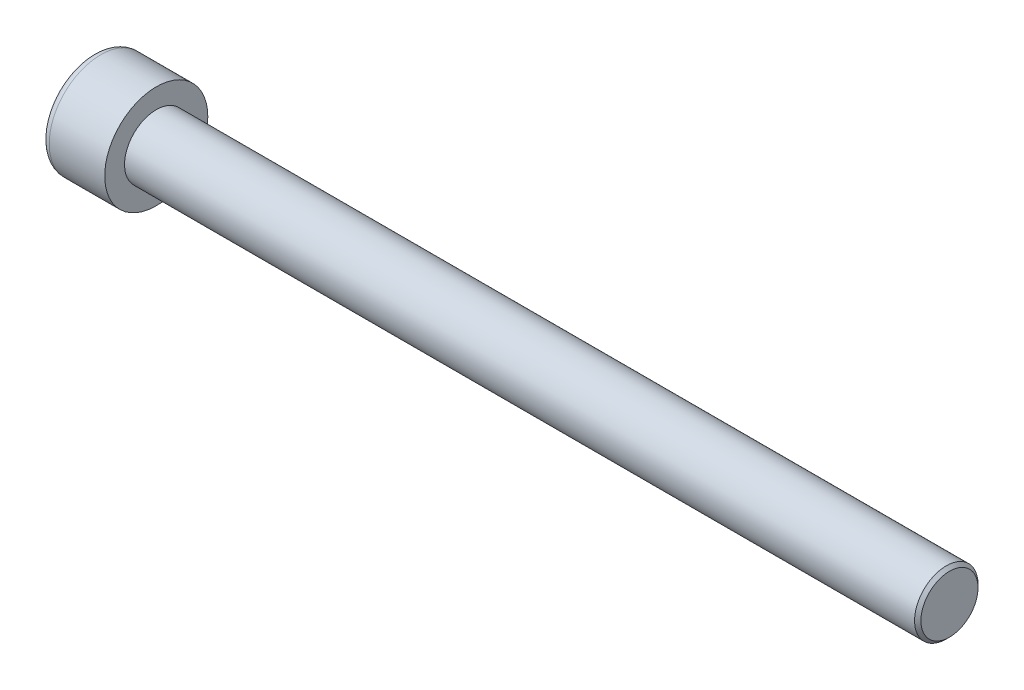
ISO-10303-21;
HEADER;
FILE_DESCRIPTION(('STEP AP214'),'2;1');
FILE_NAME('part.step','',(''),(''),'','','');
FILE_SCHEMA(('AUTOMOTIVE_DESIGN { 1 0 10303 214 1 1 1 1 }'));
ENDSEC;
DATA;
#1=APPLICATION_CONTEXT('core data for automotive mechanical design processes');
#2=APPLICATION_PROTOCOL_DEFINITION('international standard','automotive_design',2000,#1);
#3=PRODUCT_CONTEXT('',#1,'mechanical');
#4=PRODUCT('Part','Part','',(#3));
#5=PRODUCT_RELATED_PRODUCT_CATEGORY('part','',(#4));
#6=PRODUCT_DEFINITION_FORMATION('','',#4);
#7=PRODUCT_DEFINITION_CONTEXT('part definition',#1,'design');
#8=PRODUCT_DEFINITION('design','',#6,#7);
#9=PRODUCT_DEFINITION_SHAPE('','',#8);
#10=(LENGTH_UNIT() NAMED_UNIT(*) SI_UNIT(.MILLI.,.METRE.));
#11=(NAMED_UNIT(*) PLANE_ANGLE_UNIT() SI_UNIT($,.RADIAN.));
#12=(NAMED_UNIT(*) SI_UNIT($,.STERADIAN.) SOLID_ANGLE_UNIT());
#13=UNCERTAINTY_MEASURE_WITH_UNIT(LENGTH_MEASURE(1.E-05),#10,'distance_accuracy_value','');
#14=(GEOMETRIC_REPRESENTATION_CONTEXT(3) GLOBAL_UNCERTAINTY_ASSIGNED_CONTEXT((#13)) GLOBAL_UNIT_ASSIGNED_CONTEXT((#10,
#11,#12)) REPRESENTATION_CONTEXT('',''));
#15=CARTESIAN_POINT('',(0.,0.,0.));
#16=DIRECTION('',(0.,0.,1.));
#17=DIRECTION('',(1.,0.,0.));
#18=AXIS2_PLACEMENT_3D('',#15,#16,#17);
#19=CARTESIAN_POINT('',(4.,0.,-3.46410161513775));
#20=DIRECTION('',(1.,0.,0.));
#21=DIRECTION('',(0.,0.,-1.));
#22=AXIS2_PLACEMENT_3D('',#19,#20,#21);
#23=PLANE('',#22);
#24=CARTESIAN_POINT('',(4.,0.,0.));
#25=DIRECTION('',(1.,0.,0.));
#26=DIRECTION('',(0.,0.,-1.));
#27=AXIS2_PLACEMENT_3D('',#24,#25,#26);
#28=CIRCLE('',#27,3.);
#29=CARTESIAN_POINT('',(4.,-1.5,-2.59807621135332));
#30=VERTEX_POINT('',#29);
#31=CARTESIAN_POINT('',(4.,-3.,0.));
#32=VERTEX_POINT('',#31);
#33=EDGE_CURVE('E156',#30,#32,#28,.F.);
#34=ORIENTED_EDGE('',*,*,#33,.F.);
#35=DIRECTION('',(0.,0.866025403784439,-0.5));
#36=VECTOR('',#35,1.);
#37=CARTESIAN_POINT('',(4.,-3.,-1.73205080756887));
#38=LINE('',#37,#36);
#39=CARTESIAN_POINT('',(4.,-3.,-1.73205080756887));
#40=VERTEX_POINT('',#39);
#41=EDGE_CURVE('E164',#40,#30,#38,.T.);
#42=ORIENTED_EDGE('',*,*,#41,.F.);
#43=DIRECTION('',(0.,0.,-1.));
#44=VECTOR('',#43,1.);
#45=CARTESIAN_POINT('',(4.,-3.,1.73205080756888));
#46=LINE('',#45,#44);
#47=EDGE_CURVE('E181',#32,#40,#46,.T.);
#48=ORIENTED_EDGE('',*,*,#47,.F.);
#49=EDGE_LOOP('',(#34,#42,#48));
#50=FACE_BOUND('',#49,.T.);
#51=ADVANCED_FACE('F33',(#50),#23,.F.);
#52=CARTESIAN_POINT('',(4.,-1.5,2.59807621135331));
#53=VERTEX_POINT('',#52);
#54=EDGE_CURVE('E285',#32,#53,#28,.F.);
#55=ORIENTED_EDGE('',*,*,#54,.F.);
#56=CARTESIAN_POINT('',(4.,-3.,1.73205080756888));
#57=VERTEX_POINT('',#56);
#58=EDGE_CURVE('E182',#57,#32,#46,.T.);
#59=ORIENTED_EDGE('',*,*,#58,.F.);
#60=DIRECTION('',(0.,-0.866025403784438,-0.5));
#61=VECTOR('',#60,1.);
#62=CARTESIAN_POINT('',(4.,0.,3.46410161513776));
#63=LINE('',#62,#61);
#64=EDGE_CURVE('E177',#53,#57,#63,.T.);
#65=ORIENTED_EDGE('',*,*,#64,.F.);
#66=EDGE_LOOP('',(#55,#59,#65));
#67=FACE_BOUND('',#66,.T.);
#68=ADVANCED_FACE('F122',(#67),#23,.F.);
#69=CARTESIAN_POINT('',(4.,1.5,2.59807621135332));
#70=VERTEX_POINT('',#69);
#71=EDGE_CURVE('E281',#53,#70,#28,.F.);
#72=ORIENTED_EDGE('',*,*,#71,.F.);
#73=CARTESIAN_POINT('',(4.,0.,3.46410161513776));
#74=VERTEX_POINT('',#73);
#75=EDGE_CURVE('E178',#74,#53,#63,.T.);
#76=ORIENTED_EDGE('',*,*,#75,.F.);
#77=DIRECTION('',(0.,-0.866025403784439,0.5));
#78=VECTOR('',#77,1.);
#79=CARTESIAN_POINT('',(4.,3.,1.73205080756888));
#80=LINE('',#79,#78);
#81=EDGE_CURVE('E173',#70,#74,#80,.T.);
#82=ORIENTED_EDGE('',*,*,#81,.F.);
#83=EDGE_LOOP('',(#72,#76,#82));
#84=FACE_BOUND('',#83,.T.);
#85=ADVANCED_FACE('F128',(#84),#23,.F.);
#86=CARTESIAN_POINT('',(4.,3.,0.));
#87=VERTEX_POINT('',#86);
#88=EDGE_CURVE('E153',#70,#87,#28,.F.);
#89=ORIENTED_EDGE('',*,*,#88,.F.);
#90=CARTESIAN_POINT('',(4.,3.,1.73205080756888));
#91=VERTEX_POINT('',#90);
#92=EDGE_CURVE('E174',#91,#70,#80,.T.);
#93=ORIENTED_EDGE('',*,*,#92,.F.);
#94=DIRECTION('',(0.,0.,1.));
#95=VECTOR('',#94,1.);
#96=CARTESIAN_POINT('',(4.,3.,-1.73205080756887));
#97=LINE('',#96,#95);
#98=EDGE_CURVE('E168',#87,#91,#97,.T.);
#99=ORIENTED_EDGE('',*,*,#98,.F.);
#100=EDGE_LOOP('',(#89,#93,#99));
#101=FACE_BOUND('',#100,.T.);
#102=ADVANCED_FACE('F142',(#101),#23,.F.);
#103=CARTESIAN_POINT('',(4.,0.,0.));
#104=DIRECTION('',(1.,0.,0.));
#105=DIRECTION('',(0.,0.,-1.));
#106=AXIS2_PLACEMENT_3D('',#103,#104,#105);
#107=CIRCLE('',#106,3.);
#108=CARTESIAN_POINT('',(4.,1.5,-2.59807621135331));
#109=VERTEX_POINT('',#108);
#110=EDGE_CURVE('E48',#109,#87,#107,.T.);
#111=ORIENTED_EDGE('',*,*,#110,.T.);
#112=CARTESIAN_POINT('',(4.,3.,-1.73205080756887));
#113=VERTEX_POINT('',#112);
#114=EDGE_CURVE('E161',#113,#87,#97,.T.);
#115=ORIENTED_EDGE('',*,*,#114,.F.);
#116=DIRECTION('',(0.,0.866025403784438,0.5));
#117=VECTOR('',#116,1.);
#118=CARTESIAN_POINT('',(4.,0.,-3.46410161513775));
#119=LINE('',#118,#117);
#120=EDGE_CURVE('E158',#109,#113,#119,.T.);
#121=ORIENTED_EDGE('',*,*,#120,.F.);
#122=EDGE_LOOP('',(#111,#115,#121));
#123=FACE_BOUND('',#122,.T.);
#124=ADVANCED_FACE('F133',(#123),#23,.F.);
#125=EDGE_CURVE('E146',#109,#30,#28,.F.);
#126=ORIENTED_EDGE('',*,*,#125,.F.);
#127=CARTESIAN_POINT('',(4.,0.,-3.46410161513775));
#128=VERTEX_POINT('',#127);
#129=EDGE_CURVE('E149',#128,#109,#119,.T.);
#130=ORIENTED_EDGE('',*,*,#129,.F.);
#131=EDGE_CURVE('E151',#30,#128,#38,.T.);
#132=ORIENTED_EDGE('',*,*,#131,.F.);
#133=EDGE_LOOP('',(#126,#130,#132));
#134=FACE_BOUND('',#133,.T.);
#135=ADVANCED_FACE('F124',(#134),#23,.F.);
#136=CARTESIAN_POINT('',(0.,0.,0.));
#137=DIRECTION('',(1.,0.,0.));
#138=DIRECTION('',(0.,0.,-1.));
#139=AXIS2_PLACEMENT_3D('',#136,#137,#138);
#140=PLANE('',#139);
#141=CARTESIAN_POINT('',(0.,0.,0.));
#142=DIRECTION('',(1.,0.,0.));
#143=DIRECTION('',(0.,0.,-1.));
#144=AXIS2_PLACEMENT_3D('',#141,#142,#143);
#145=CIRCLE('',#144,5.5);
#146=CARTESIAN_POINT('',(0.,0.,-5.5));
#147=VERTEX_POINT('',#146);
#148=EDGE_CURVE('E220',#147,#147,#145,.F.);
#149=ORIENTED_EDGE('',*,*,#148,.T.);
#150=EDGE_LOOP('',(#149));
#151=FACE_BOUND('',#150,.T.);
#152=DIRECTION('',(0.,0.866025403784439,-0.5));
#153=VECTOR('',#152,1.);
#154=CARTESIAN_POINT('',(0.,-3.,-1.73205080756887));
#155=LINE('',#154,#153);
#156=CARTESIAN_POINT('',(0.,-3.,-1.73205080756887));
#157=VERTEX_POINT('',#156);
#158=CARTESIAN_POINT('',(0.,0.,-3.46410161513775));
#159=VERTEX_POINT('',#158);
#160=EDGE_CURVE('E56',#157,#159,#155,.T.);
#161=ORIENTED_EDGE('',*,*,#160,.T.);
#162=DIRECTION('',(0.,0.866025403784438,0.5));
#163=VECTOR('',#162,1.);
#164=CARTESIAN_POINT('',(0.,0.,-3.46410161513775));
#165=LINE('',#164,#163);
#166=CARTESIAN_POINT('',(0.,3.,-1.73205080756887));
#167=VERTEX_POINT('',#166);
#168=EDGE_CURVE('E187',#159,#167,#165,.T.);
#169=ORIENTED_EDGE('',*,*,#168,.T.);
#170=DIRECTION('',(0.,0.,1.));
#171=VECTOR('',#170,1.);
#172=CARTESIAN_POINT('',(0.,3.,-1.73205080756887));
#173=LINE('',#172,#171);
#174=CARTESIAN_POINT('',(0.,3.,1.73205080756888));
#175=VERTEX_POINT('',#174);
#176=EDGE_CURVE('E190',#167,#175,#173,.T.);
#177=ORIENTED_EDGE('',*,*,#176,.T.);
#178=DIRECTION('',(0.,-0.866025403784439,0.5));
#179=VECTOR('',#178,1.);
#180=CARTESIAN_POINT('',(0.,3.,1.73205080756888));
#181=LINE('',#180,#179);
#182=CARTESIAN_POINT('',(0.,0.,3.46410161513776));
#183=VERTEX_POINT('',#182);
#184=EDGE_CURVE('E193',#175,#183,#181,.T.);
#185=ORIENTED_EDGE('',*,*,#184,.T.);
#186=DIRECTION('',(0.,-0.866025403784438,-0.5));
#187=VECTOR('',#186,1.);
#188=CARTESIAN_POINT('',(0.,0.,3.46410161513776));
#189=LINE('',#188,#187);
#190=CARTESIAN_POINT('',(0.,-3.,1.73205080756888));
#191=VERTEX_POINT('',#190);
#192=EDGE_CURVE('E196',#183,#191,#189,.T.);
#193=ORIENTED_EDGE('',*,*,#192,.T.);
#194=DIRECTION('',(0.,0.,-1.));
#195=VECTOR('',#194,1.);
#196=CARTESIAN_POINT('',(0.,-3.,1.73205080756888));
#197=LINE('',#196,#195);
#198=EDGE_CURVE('E199',#191,#157,#197,.T.);
#199=ORIENTED_EDGE('',*,*,#198,.T.);
#200=EDGE_LOOP('',(#161,#169,#177,#185,#193,#199));
#201=FACE_BOUND('',#200,.T.);
#202=ADVANCED_FACE('F132',(#151,#201),#140,.F.);
#203=CARTESIAN_POINT('',(8.,0.,0.));
#204=DIRECTION('',(1.,0.,0.));
#205=DIRECTION('',(0.,0.,-1.));
#206=AXIS2_PLACEMENT_3D('',#203,#204,#205);
#207=PLANE('',#206);
#208=CARTESIAN_POINT('',(8.,0.,0.));
#209=DIRECTION('',(1.,0.,0.));
#210=DIRECTION('',(0.,0.,-1.));
#211=AXIS2_PLACEMENT_3D('',#208,#209,#210);
#212=CIRCLE('',#211,6.5);
#213=CARTESIAN_POINT('',(8.,0.,-6.5));
#214=VERTEX_POINT('',#213);
#215=EDGE_CURVE('E154',#214,#214,#212,.T.);
#216=ORIENTED_EDGE('',*,*,#215,.T.);
#217=EDGE_LOOP('',(#216));
#218=FACE_BOUND('',#217,.T.);
#219=CARTESIAN_POINT('',(8.,0.,0.));
#220=DIRECTION('',(1.,0.,0.));
#221=DIRECTION('',(0.,0.,-1.));
#222=AXIS2_PLACEMENT_3D('',#219,#220,#221);
#223=CIRCLE('',#222,4.);
#224=CARTESIAN_POINT('',(8.,0.,-4.));
#225=VERTEX_POINT('',#224);
#226=EDGE_CURVE('E212',#225,#225,#223,.T.);
#227=ORIENTED_EDGE('',*,*,#226,.F.);
#228=EDGE_LOOP('',(#227));
#229=FACE_BOUND('',#228,.T.);
#230=ADVANCED_FACE('F139',(#218,#229),#207,.T.);
#231=CARTESIAN_POINT('',(8.,0.,0.));
#232=DIRECTION('',(-1.,0.,0.));
#233=DIRECTION('',(0.,0.,1.));
#234=AXIS2_PLACEMENT_3D('',#231,#232,#233);
#235=CYLINDRICAL_SURFACE('',#234,6.5);
#236=CARTESIAN_POINT('',(1.,0.,0.));
#237=DIRECTION('',(1.,0.,0.));
#238=DIRECTION('',(0.,0.,-1.));
#239=AXIS2_PLACEMENT_3D('',#236,#237,#238);
#240=CIRCLE('',#239,6.5);
#241=CARTESIAN_POINT('',(1.,0.,-6.5));
#242=VERTEX_POINT('',#241);
#243=EDGE_CURVE('E217',#242,#242,#240,.T.);
#244=ORIENTED_EDGE('',*,*,#243,.T.);
#245=EDGE_LOOP('',(#244));
#246=FACE_BOUND('',#245,.T.);
#247=ORIENTED_EDGE('',*,*,#215,.F.);
#248=EDGE_LOOP('',(#247));
#249=FACE_BOUND('',#248,.T.);
#250=ADVANCED_FACE('F236',(#246,#249),#235,.T.);
#251=CARTESIAN_POINT('',(108.,0.,0.));
#252=DIRECTION('',(-1.,0.,0.));
#253=DIRECTION('',(0.,0.,1.));
#254=AXIS2_PLACEMENT_3D('',#251,#252,#253);
#255=CYLINDRICAL_SURFACE('',#254,4.);
#256=CARTESIAN_POINT('',(107.6,0.,0.));
#257=DIRECTION('',(1.,0.,0.));
#258=DIRECTION('',(0.,0.,-1.));
#259=AXIS2_PLACEMENT_3D('',#256,#257,#258);
#260=CIRCLE('',#259,4.);
#261=CARTESIAN_POINT('',(107.6,0.,-4.));
#262=VERTEX_POINT('',#261);
#263=EDGE_CURVE('E11',#262,#262,#260,.F.);
#264=ORIENTED_EDGE('',*,*,#263,.T.);
#265=EDGE_LOOP('',(#264));
#266=FACE_BOUND('',#265,.T.);
#267=ORIENTED_EDGE('',*,*,#226,.T.);
#268=EDGE_LOOP('',(#267));
#269=FACE_BOUND('',#268,.T.);
#270=ADVANCED_FACE('F233',(#266,#269),#255,.T.);
#271=CARTESIAN_POINT('',(108.,0.,0.));
#272=DIRECTION('',(1.,0.,0.));
#273=DIRECTION('',(0.,0.,-1.));
#274=AXIS2_PLACEMENT_3D('',#271,#272,#273);
#275=PLANE('',#274);
#276=CARTESIAN_POINT('',(108.,0.,0.));
#277=DIRECTION('',(1.,0.,0.));
#278=DIRECTION('',(0.,0.,-1.));
#279=AXIS2_PLACEMENT_3D('',#276,#277,#278);
#280=CIRCLE('',#279,3.60000000000001);
#281=CARTESIAN_POINT('',(108.,0.,-3.60000000000001));
#282=VERTEX_POINT('',#281);
#283=EDGE_CURVE('E41',#282,#282,#280,.T.);
#284=ORIENTED_EDGE('',*,*,#283,.T.);
#285=EDGE_LOOP('',(#284));
#286=FACE_BOUND('',#285,.T.);
#287=ADVANCED_FACE('F225',(#286),#275,.T.);
#288=CARTESIAN_POINT('',(4.,-3.,-1.73205080756887));
#289=DIRECTION('',(0.,0.5,0.866025403784439));
#290=DIRECTION('',(0.,-0.866025403784439,0.5));
#291=AXIS2_PLACEMENT_3D('',#288,#289,#290);
#292=PLANE('',#291);
#293=ORIENTED_EDGE('',*,*,#160,.F.);
#294=DIRECTION('',(-1.,0.,0.));
#295=VECTOR('',#294,1.);
#296=CARTESIAN_POINT('',(4.,-3.,-1.73205080756887));
#297=LINE('',#296,#295);
#298=EDGE_CURVE('E185',#40,#157,#297,.T.);
#299=ORIENTED_EDGE('',*,*,#298,.F.);
#300=ORIENTED_EDGE('',*,*,#41,.T.);
#301=ORIENTED_EDGE('',*,*,#131,.T.);
#302=DIRECTION('',(-1.,0.,0.));
#303=VECTOR('',#302,1.);
#304=CARTESIAN_POINT('',(4.,0.,-3.46410161513775));
#305=LINE('',#304,#303);
#306=EDGE_CURVE('E167',#128,#159,#305,.T.);
#307=ORIENTED_EDGE('',*,*,#306,.T.);
#308=EDGE_LOOP('',(#293,#299,#300,#301,#307));
#309=FACE_BOUND('',#308,.T.);
#310=ADVANCED_FACE('F251',(#309),#292,.T.);
#311=CARTESIAN_POINT('',(4.,0.,-3.46410161513775));
#312=DIRECTION('',(0.,-0.5,0.866025403784438));
#313=DIRECTION('',(0.,-0.866025403784438,-0.5));
#314=AXIS2_PLACEMENT_3D('',#311,#312,#313);
#315=PLANE('',#314);
#316=ORIENTED_EDGE('',*,*,#168,.F.);
#317=ORIENTED_EDGE('',*,*,#306,.F.);
#318=ORIENTED_EDGE('',*,*,#129,.T.);
#319=ORIENTED_EDGE('',*,*,#120,.T.);
#320=DIRECTION('',(-1.,0.,0.));
#321=VECTOR('',#320,1.);
#322=CARTESIAN_POINT('',(4.,3.,-1.73205080756887));
#323=LINE('',#322,#321);
#324=EDGE_CURVE('E209',#113,#167,#323,.T.);
#325=ORIENTED_EDGE('',*,*,#324,.T.);
#326=EDGE_LOOP('',(#316,#317,#318,#319,#325));
#327=FACE_BOUND('',#326,.T.);
#328=ADVANCED_FACE('F166',(#327),#315,.T.);
#329=CARTESIAN_POINT('',(4.,3.,-1.73205080756887));
#330=DIRECTION('',(0.,-1.,0.));
#331=DIRECTION('',(0.,0.,-1.));
#332=AXIS2_PLACEMENT_3D('',#329,#330,#331);
#333=PLANE('',#332);
#334=ORIENTED_EDGE('',*,*,#176,.F.);
#335=ORIENTED_EDGE('',*,*,#324,.F.);
#336=ORIENTED_EDGE('',*,*,#114,.T.);
#337=ORIENTED_EDGE('',*,*,#98,.T.);
#338=DIRECTION('',(-1.,0.,0.));
#339=VECTOR('',#338,1.);
#340=CARTESIAN_POINT('',(4.,3.,1.73205080756888));
#341=LINE('',#340,#339);
#342=EDGE_CURVE('E207',#91,#175,#341,.T.);
#343=ORIENTED_EDGE('',*,*,#342,.T.);
#344=EDGE_LOOP('',(#334,#335,#336,#337,#343));
#345=FACE_BOUND('',#344,.T.);
#346=ADVANCED_FACE('F256',(#345),#333,.T.);
#347=CARTESIAN_POINT('',(4.,3.,1.73205080756888));
#348=DIRECTION('',(0.,-0.5,-0.866025403784439));
#349=DIRECTION('',(0.,0.866025403784439,-0.5));
#350=AXIS2_PLACEMENT_3D('',#347,#348,#349);
#351=PLANE('',#350);
#352=ORIENTED_EDGE('',*,*,#184,.F.);
#353=ORIENTED_EDGE('',*,*,#342,.F.);
#354=ORIENTED_EDGE('',*,*,#92,.T.);
#355=ORIENTED_EDGE('',*,*,#81,.T.);
#356=DIRECTION('',(-1.,0.,0.));
#357=VECTOR('',#356,1.);
#358=CARTESIAN_POINT('',(4.,0.,3.46410161513776));
#359=LINE('',#358,#357);
#360=EDGE_CURVE('E205',#74,#183,#359,.T.);
#361=ORIENTED_EDGE('',*,*,#360,.T.);
#362=EDGE_LOOP('',(#352,#353,#354,#355,#361));
#363=FACE_BOUND('',#362,.T.);
#364=ADVANCED_FACE('F259',(#363),#351,.T.);
#365=CARTESIAN_POINT('',(4.,0.,3.46410161513776));
#366=DIRECTION('',(0.,0.5,-0.866025403784438));
#367=DIRECTION('',(0.,0.866025403784438,0.5));
#368=AXIS2_PLACEMENT_3D('',#365,#366,#367);
#369=PLANE('',#368);
#370=ORIENTED_EDGE('',*,*,#192,.F.);
#371=ORIENTED_EDGE('',*,*,#360,.F.);
#372=ORIENTED_EDGE('',*,*,#75,.T.);
#373=ORIENTED_EDGE('',*,*,#64,.T.);
#374=DIRECTION('',(-1.,0.,0.));
#375=VECTOR('',#374,1.);
#376=CARTESIAN_POINT('',(4.,-3.,1.73205080756888));
#377=LINE('',#376,#375);
#378=EDGE_CURVE('E203',#57,#191,#377,.T.);
#379=ORIENTED_EDGE('',*,*,#378,.T.);
#380=EDGE_LOOP('',(#370,#371,#372,#373,#379));
#381=FACE_BOUND('',#380,.T.);
#382=ADVANCED_FACE('F117',(#381),#369,.T.);
#383=CARTESIAN_POINT('',(4.,-3.,1.73205080756888));
#384=DIRECTION('',(0.,1.,0.));
#385=DIRECTION('',(0.,0.,1.));
#386=AXIS2_PLACEMENT_3D('',#383,#384,#385);
#387=PLANE('',#386);
#388=ORIENTED_EDGE('',*,*,#198,.F.);
#389=ORIENTED_EDGE('',*,*,#378,.F.);
#390=ORIENTED_EDGE('',*,*,#58,.T.);
#391=ORIENTED_EDGE('',*,*,#47,.T.);
#392=ORIENTED_EDGE('',*,*,#298,.T.);
#393=EDGE_LOOP('',(#388,#389,#390,#391,#392));
#394=FACE_BOUND('',#393,.T.);
#395=ADVANCED_FACE('F110',(#394),#387,.T.);
#396=CARTESIAN_POINT('',(4.,0.,0.));
#397=DIRECTION('',(-1.,0.,0.));
#398=DIRECTION('',(0.,0.,1.));
#399=AXIS2_PLACEMENT_3D('',#396,#397,#398);
#400=CONICAL_SURFACE('',#399,3.,1.04719755119659);
#401=CARTESIAN_POINT('',(5.7320508075689,0.,0.));
#402=VERTEX_POINT('',#401);
#403=VERTEX_LOOP('',#402);
#404=FACE_BOUND('',#403,.T.);
#405=ORIENTED_EDGE('',*,*,#110,.F.);
#406=ORIENTED_EDGE('',*,*,#125,.T.);
#407=ORIENTED_EDGE('',*,*,#33,.T.);
#408=ORIENTED_EDGE('',*,*,#54,.T.);
#409=ORIENTED_EDGE('',*,*,#71,.T.);
#410=ORIENTED_EDGE('',*,*,#88,.T.);
#411=EDGE_LOOP('',(#405,#406,#407,#408,#409,#410));
#412=FACE_BOUND('',#411,.T.);
#413=ADVANCED_FACE('F107',(#404,#412),#400,.F.);
#414=CARTESIAN_POINT('',(1.,0.,0.));
#415=DIRECTION('',(1.,0.,0.));
#416=DIRECTION('',(0.,0.,-1.));
#417=AXIS2_PLACEMENT_3D('',#414,#415,#416);
#418=TOROIDAL_SURFACE('',#417,5.5,1.);
#419=ORIENTED_EDGE('',*,*,#148,.F.);
#420=EDGE_LOOP('',(#419));
#421=FACE_BOUND('',#420,.T.);
#422=ORIENTED_EDGE('',*,*,#243,.F.);
#423=EDGE_LOOP('',(#422));
#424=FACE_BOUND('',#423,.T.);
#425=ADVANCED_FACE('F109',(#421,#424),#418,.T.);
#426=CARTESIAN_POINT('',(108.,0.,0.));
#427=DIRECTION('',(-1.,0.,0.));
#428=DIRECTION('',(0.,0.,1.));
#429=AXIS2_PLACEMENT_3D('',#426,#427,#428);
#430=CONICAL_SURFACE('',#429,3.60000000000001,0.785398163397444);
#431=ORIENTED_EDGE('',*,*,#263,.F.);
#432=EDGE_LOOP('',(#431));
#433=FACE_BOUND('',#432,.T.);
#434=ORIENTED_EDGE('',*,*,#283,.F.);
#435=EDGE_LOOP('',(#434));
#436=FACE_BOUND('',#435,.T.);
#437=ADVANCED_FACE('F35',(#433,#436),#430,.T.);
#438=CLOSED_SHELL('',(#51,#68,#85,#102,#124,#135,#202,#230,#250,#270,#287,#310,#328,#346,#364,
#382,#395,#413,#425,#437));
#439=MANIFOLD_SOLID_BREP('B2',#438);
#440=ADVANCED_BREP_SHAPE_REPRESENTATION('',(#18,#439),#14);
#441=SHAPE_DEFINITION_REPRESENTATION(#9,#440);
ENDSEC;
END-ISO-10303-21;
